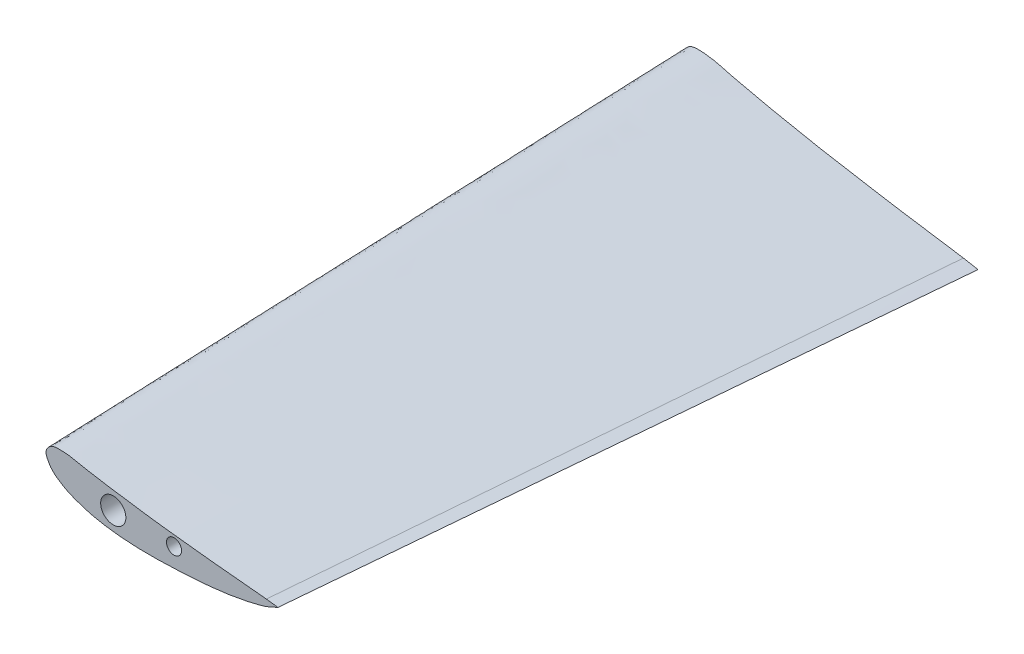
ISO-10303-21;
HEADER;
FILE_DESCRIPTION(('STEP AP214'),'2;1');
FILE_NAME('part.step','',(''),(''),'','','');
FILE_SCHEMA(('AUTOMOTIVE_DESIGN { 1 0 10303 214 1 1 1 1 }'));
ENDSEC;
DATA;
#1=APPLICATION_CONTEXT('core data for automotive mechanical design processes');
#2=APPLICATION_PROTOCOL_DEFINITION('international standard','automotive_design',2000,#1);
#3=PRODUCT_CONTEXT('',#1,'mechanical');
#4=PRODUCT('Part','Part','',(#3));
#5=PRODUCT_RELATED_PRODUCT_CATEGORY('part','',(#4));
#6=PRODUCT_DEFINITION_FORMATION('','',#4);
#7=PRODUCT_DEFINITION_CONTEXT('part definition',#1,'design');
#8=PRODUCT_DEFINITION('design','',#6,#7);
#9=PRODUCT_DEFINITION_SHAPE('','',#8);
#10=(LENGTH_UNIT() NAMED_UNIT(*) SI_UNIT(.MILLI.,.METRE.));
#11=(NAMED_UNIT(*) PLANE_ANGLE_UNIT() SI_UNIT($,.RADIAN.));
#12=(NAMED_UNIT(*) SI_UNIT($,.STERADIAN.) SOLID_ANGLE_UNIT());
#13=UNCERTAINTY_MEASURE_WITH_UNIT(LENGTH_MEASURE(1.E-05),#10,'distance_accuracy_value','');
#14=(GEOMETRIC_REPRESENTATION_CONTEXT(3) GLOBAL_UNCERTAINTY_ASSIGNED_CONTEXT((#13)) GLOBAL_UNIT_ASSIGNED_CONTEXT((#10,
#11,#12)) REPRESENTATION_CONTEXT('',''));
#15=CARTESIAN_POINT('',(0.,0.,0.));
#16=DIRECTION('',(0.,0.,1.));
#17=DIRECTION('',(1.,0.,0.));
#18=AXIS2_PLACEMENT_3D('',#15,#16,#17);
#19=CARTESIAN_POINT('',(-15.9573386578838,2.72947172335381,-130.));
#20=DIRECTION('',(0.,0.,1.));
#21=DIRECTION('',(1.,0.,0.));
#22=AXIS2_PLACEMENT_3D('',#19,#20,#21);
#23=PLANE('',#22);
#24=CARTESIAN_POINT('',(12.063322186895,-0.172116284613179,-130.));
#25=DIRECTION('',(0.,0.,1.));
#26=DIRECTION('',(1.,0.,0.));
#27=AXIS2_PLACEMENT_3D('',#24,#25,#26);
#28=CIRCLE('',#27,1.5);
#29=CARTESIAN_POINT('',(13.563322186895,-0.172116284613179,-130.));
#30=VERTEX_POINT('',#29);
#31=EDGE_CURVE('E87',#30,#30,#28,.T.);
#32=ORIENTED_EDGE('',*,*,#31,.T.);
#33=EDGE_LOOP('',(#32));
#34=FACE_BOUND('',#33,.T.);
#35=CARTESIAN_POINT('',(0.,0.,-130.));
#36=DIRECTION('',(0.,0.,1.));
#37=DIRECTION('',(1.,0.,0.));
#38=AXIS2_PLACEMENT_3D('',#35,#36,#37);
#39=CIRCLE('',#38,2.5);
#40=CARTESIAN_POINT('',(2.5,0.,-130.));
#41=VERTEX_POINT('',#40);
#42=EDGE_CURVE('E68',#41,#41,#39,.T.);
#43=ORIENTED_EDGE('',*,*,#42,.T.);
#44=EDGE_LOOP('',(#43));
#45=FACE_BOUND('',#44,.T.);
#46=CARTESIAN_POINT('',(38.8120781774416,-2.20153056453192,-130.));
#47=CARTESIAN_POINT('',(37.8397868419316,-2.05195685649604,-130.));
#48=CARTESIAN_POINT('',(34.9229128354023,-1.60323573238921,-130.));
#49=CARTESIAN_POINT('',(30.062980923386,-0.846025072664264,-130.));
#50=CARTESIAN_POINT('',(24.2243965531818,0.0176889752878256,-130.));
#51=CARTESIAN_POINT('',(18.4132903557065,1.04566342823261,-130.));
#52=CARTESIAN_POINT('',(12.5873231478176,1.98257894073304,-130.));
#53=CARTESIAN_POINT('',(6.79722177850616,3.11883992926039,-130.));
#54=CARTESIAN_POINT('',(1.00440763839932,4.24699575258884,-130.));
#55=CARTESIAN_POINT('',(-3.79170799952262,5.33941839040036,-130.));
#56=CARTESIAN_POINT('',(-7.63590457845037,6.19843141355677,-130.));
#57=CARTESIAN_POINT('',(-9.99480768621524,6.91459953998816,-130.));
#58=CARTESIAN_POINT('',(-11.9472230297003,7.23200790023331,-130.));
#59=CARTESIAN_POINT('',(-13.4277399267656,7.35528494884751,-130.));
#60=CARTESIAN_POINT('',(-14.768994504793,7.36382199207013,-130.));
#61=CARTESIAN_POINT('',(-16.0847204559753,6.74822291699015,-130.));
#62=CARTESIAN_POINT('',(-17.1492251932457,5.30606659514906,-130.));
#63=CARTESIAN_POINT('',(-16.4517203902266,3.68648758126931,-130.));
#64=CARTESIAN_POINT('',(-15.7478921773808,2.26296929841352,-130.));
#65=CARTESIAN_POINT('',(-14.6557396375938,1.10186245155615,-130.));
#66=CARTESIAN_POINT('',(-13.2899093160326,0.0781647088307033,-130.));
#67=CARTESIAN_POINT('',(-11.5384922386438,-1.10058705011428,-130.));
#68=CARTESIAN_POINT('',(-9.19576672428071,-2.13584430490646,-130.));
#69=CARTESIAN_POINT('',(-5.47589025803957,-3.5743655347333,-130.));
#70=CARTESIAN_POINT('',(-0.643108893754979,-4.68760771879476,-130.));
#71=CARTESIAN_POINT('',(5.22471927578042,-5.49019662314985,-130.));
#72=CARTESIAN_POINT('',(11.1624164545053,-5.82550900839239,-130.));
#73=CARTESIAN_POINT('',(17.1412966125503,-5.93304648920771,-130.));
#74=CARTESIAN_POINT('',(23.1670560499333,-5.85696775159353,-130.));
#75=CARTESIAN_POINT('',(29.2675115694788,-5.51749328815515,-130.));
#76=CARTESIAN_POINT('',(34.3818603874594,-4.80270030943601,-130.));
#77=CARTESIAN_POINT('',(38.5985870919679,-3.99453880924095,-130.));
#78=CARTESIAN_POINT('',(40.6515069729154,-3.16590061016798,-130.));
#79=CARTESIAN_POINT('',(41.71283654,-2.73750677500001,-130.));
#80=B_SPLINE_CURVE_WITH_KNOTS('',3,(#46,#47,#48,#49,#50,#51,#52,#53,#54,#55,#56,#57,#58,#59,#60,
#61,#62,#63,#64,#65,#66,#67,#68,#69,#70,#71,#72,#73,#74,#75,#76,#77,#78,#79),.UNSPECIFIED.,.F.,
.F.,(4,1,1,1,1,1,1,1,1,1,1,1,1,1,1,1,1,1,1,1,1,1,1,1,1,1,1,1,1,1,1,4),(0.,0.024539223239315,
0.0736176697179449,0.122696116196575,0.171758102468826,0.220820088741077,0.269879113320182,
0.318936693489756,0.368025361597795,0.392583028094628,0.417173001250673,0.429440472758663,
0.441764658743505,0.454461371263475,0.461994015532278,0.477712656864197,0.492780517083889,
0.502278122505289,0.517831839222446,0.531656069899839,0.544957030128068,0.57036121074101,
0.595284183630096,0.644429948946362,0.693535769444944,0.742943262592495,0.792666042354747,
0.842690657547491,0.893260265870848,0.94491578158227,0.971522264346957,1.),.UNSPECIFIED.);
#81=CARTESIAN_POINT('',(38.8120781774416,-2.20153056453192,-130.));
#82=VERTEX_POINT('',#81);
#83=CARTESIAN_POINT('',(41.71283654,-2.73750677500001,-130.));
#84=VERTEX_POINT('',#83);
#85=EDGE_CURVE('E63',#82,#84,#80,.T.);
#86=ORIENTED_EDGE('',*,*,#85,.F.);
#87=DIRECTION('',(-0.983354838258924,0.18169552023307,0.));
#88=VECTOR('',#87,1.);
#89=CARTESIAN_POINT('',(38.8120781774416,-2.20153056453192,-130.));
#90=LINE('',#89,#88);
#91=EDGE_CURVE('E37',#84,#82,#90,.T.);
#92=ORIENTED_EDGE('',*,*,#91,.F.);
#93=EDGE_LOOP('',(#86,#92));
#94=FACE_BOUND('',#93,.T.);
#95=ADVANCED_FACE('F34',(#34,#45,#94),#23,.F.);
#96=CARTESIAN_POINT('',(-12.5819997362755,1.44490278911865,0.));
#97=DIRECTION('',(0.,0.,1.));
#98=DIRECTION('',(1.,0.,0.));
#99=AXIS2_PLACEMENT_3D('',#96,#97,#98);
#100=PLANE('',#99);
#101=CARTESIAN_POINT('',(12.063322186895,-0.172116284613179,0.));
#102=DIRECTION('',(0.,0.,1.));
#103=DIRECTION('',(1.,0.,0.));
#104=AXIS2_PLACEMENT_3D('',#101,#102,#103);
#105=CIRCLE('',#104,1.5);
#106=CARTESIAN_POINT('',(13.563322186895,-0.172116284613179,0.));
#107=VERTEX_POINT('',#106);
#108=EDGE_CURVE('E90',#107,#107,#105,.T.);
#109=ORIENTED_EDGE('',*,*,#108,.F.);
#110=EDGE_LOOP('',(#109));
#111=FACE_BOUND('',#110,.T.);
#112=CARTESIAN_POINT('',(0.,0.,0.));
#113=DIRECTION('',(0.,0.,1.));
#114=DIRECTION('',(1.,0.,0.));
#115=AXIS2_PLACEMENT_3D('',#112,#113,#114);
#116=CIRCLE('',#115,2.5);
#117=CARTESIAN_POINT('',(2.5,0.,0.));
#118=VERTEX_POINT('',#117);
#119=EDGE_CURVE('E84',#118,#118,#116,.T.);
#120=ORIENTED_EDGE('',*,*,#119,.F.);
#121=EDGE_LOOP('',(#120));
#122=FACE_BOUND('',#121,.T.);
#123=CARTESIAN_POINT('',(30.4113785621477,-0.0484002442627476,0.));
#124=CARTESIAN_POINT('',(29.6454694877873,0.026566871565662,0.));
#125=CARTESIAN_POINT('',(27.3477422647068,0.251468219050302,0.));
#126=CARTESIAN_POINT('',(23.5189856354564,0.633666696272388,0.));
#127=CARTESIAN_POINT('',(18.9212057833677,1.05691563565401,0.));
#128=CARTESIAN_POINT('',(14.3378164362077,1.60965355839776,0.));
#129=CARTESIAN_POINT('',(9.74673995821571,2.09062433500616,0.));
#130=CARTESIAN_POINT('',(5.17509493438157,2.72885063741591,0.));
#131=CARTESIAN_POINT('',(0.60167993974661,3.36062908634859,0.));
#132=CARTESIAN_POINT('',(-3.19166320344617,4.00741358924806,0.));
#133=CARTESIAN_POINT('',(-6.23140034199928,4.5128685145492,0.));
#134=CARTESIAN_POINT('',(-8.10480601021255,4.97070206772562,0.));
#135=CARTESIAN_POINT('',(-9.6435286668681,5.134562868883,0.));
#136=CARTESIAN_POINT('',(-10.8052865093902,5.16710523802775,0.));
#137=CARTESIAN_POINT('',(-11.8533241938368,5.1160194218416,0.));
#138=CARTESIAN_POINT('',(-12.8545459614183,4.57851263632639,0.));
#139=CARTESIAN_POINT('',(-13.6239443974408,3.4061895897156,0.));
#140=CARTESIAN_POINT('',(-13.0093761995299,2.17115138802204,0.));
#141=CARTESIAN_POINT('',(-12.3983110532503,1.08953086614345,0.));
#142=CARTESIAN_POINT('',(-11.4952204988513,0.229604254835794,0.));
#143=CARTESIAN_POINT('',(-10.3842737514795,-0.511205932124786,0.));
#144=CARTESIAN_POINT('',(-8.96546395144117,-1.35652737302625,0.));
#145=CARTESIAN_POINT('',(-7.09095487017499,-2.06430188624797,0.));
#146=CARTESIAN_POINT('',(-4.12337213787246,-3.02777084468667,0.));
#147=CARTESIAN_POINT('',(-0.300492468612642,-3.68923892534138,0.));
#148=CARTESIAN_POINT('',(4.31749802810697,-4.06348304674317,0.));
#149=CARTESIAN_POINT('',(8.96994319746569,-4.06972331148482,0.));
#150=CARTESIAN_POINT('',(13.6447489370111,-3.89627252679786,0.));
#151=CARTESIAN_POINT('',(18.3482661610054,-3.5773782916158,0.));
#152=CARTESIAN_POINT('',(23.0987876160855,-3.04952608629674,0.));
#153=CARTESIAN_POINT('',(27.0628881136656,-2.27096966882288,0.));
#154=CARTESIAN_POINT('',(30.3218247503512,-1.45813343814418,0.));
#155=CARTESIAN_POINT('',(31.8897041320066,-0.722475780532528,0.));
#156=CARTESIAN_POINT('',(32.7002748517004,-0.34215152602974,0.));
#157=B_SPLINE_CURVE_WITH_KNOTS('',3,(#123,#124,#125,#126,#127,#128,#129,#130,#131,#132,#133,
#134,#135,#136,#137,#138,#139,#140,#141,#142,#143,#144,#145,#146,#147,#148,#149,#150,#151,#152,
#153,#154,#155,#156),.UNSPECIFIED.,.F.,.F.,(4,1,1,1,1,1,1,1,1,1,1,1,1,1,1,1,1,1,1,1,1,1,1,1,1,1,
1,1,1,1,1,4),(0.,0.024539223239315,0.0736176697179449,0.122696116196575,0.171758102468826,
0.220820088741077,0.269879113320182,0.318936693489756,0.368025361597795,0.392583028094628,
0.417173001250673,0.429440472758663,0.441764658743505,0.454461371263475,0.461994015532278,
0.477712656864197,0.492780517083889,0.502278122505289,0.517831839222446,0.531656069899839,
0.544957030128068,0.57036121074101,0.595284183630096,0.644429948946362,0.693535769444944,
0.742943262592495,0.792666042354747,0.842690657547491,0.893260265870848,0.94491578158227,
0.971522264346957,1.),.UNSPECIFIED.);
#158=CARTESIAN_POINT('',(30.4113785621477,-0.0484002442627476,0.));
#159=VERTEX_POINT('',#158);
#160=CARTESIAN_POINT('',(32.7002748517004,-0.34215152602974,0.));
#161=VERTEX_POINT('',#160);
#162=EDGE_CURVE('E43',#159,#161,#157,.T.);
#163=ORIENTED_EDGE('',*,*,#162,.T.);
#164=DIRECTION('',(-0.991865092818963,0.127293509839388,0.));
#165=VECTOR('',#164,1.);
#166=CARTESIAN_POINT('',(32.7002748517004,-0.34215152602974,0.));
#167=LINE('',#166,#165);
#168=EDGE_CURVE('E11',#161,#159,#167,.T.);
#169=ORIENTED_EDGE('',*,*,#168,.T.);
#170=EDGE_LOOP('',(#163,#169));
#171=FACE_BOUND('',#170,.T.);
#172=ADVANCED_FACE('F105',(#111,#122,#171),#100,.T.);
#173=CARTESIAN_POINT('',(32.7002748517004,-0.34215152602974,0.));
#174=CARTESIAN_POINT('',(41.71283654,-2.73750677500001,-130.));
#175=CARTESIAN_POINT('',(31.8897041320066,-0.722475780532528,0.));
#176=CARTESIAN_POINT('',(40.6515069729154,-3.16590061016798,-130.));
#177=CARTESIAN_POINT('',(30.3218247503512,-1.45813343814418,0.));
#178=CARTESIAN_POINT('',(38.5985870919679,-3.99453880924095,-130.));
#179=CARTESIAN_POINT('',(27.0628881136656,-2.27096966882288,0.));
#180=CARTESIAN_POINT('',(34.3818603874594,-4.80270030943601,-130.));
#181=CARTESIAN_POINT('',(23.0987876160855,-3.04952608629674,0.));
#182=CARTESIAN_POINT('',(29.2675115694788,-5.51749328815515,-130.));
#183=CARTESIAN_POINT('',(18.3482661610054,-3.5773782916158,0.));
#184=CARTESIAN_POINT('',(23.1670560499333,-5.85696775159353,-130.));
#185=CARTESIAN_POINT('',(13.6447489370111,-3.89627252679786,0.));
#186=CARTESIAN_POINT('',(17.1412966125503,-5.93304648920771,-130.));
#187=CARTESIAN_POINT('',(8.96994319746569,-4.06972331148482,0.));
#188=CARTESIAN_POINT('',(11.1624164545053,-5.82550900839239,-130.));
#189=CARTESIAN_POINT('',(4.31749802810697,-4.06348304674317,0.));
#190=CARTESIAN_POINT('',(5.22471927578042,-5.49019662314985,-130.));
#191=CARTESIAN_POINT('',(-0.300492468612642,-3.68923892534138,0.));
#192=CARTESIAN_POINT('',(-0.643108893754979,-4.68760771879476,-130.));
#193=CARTESIAN_POINT('',(-4.12337213787246,-3.02777084468667,0.));
#194=CARTESIAN_POINT('',(-5.47589025803957,-3.5743655347333,-130.));
#195=CARTESIAN_POINT('',(-7.09095487017499,-2.06430188624797,0.));
#196=CARTESIAN_POINT('',(-9.19576672428071,-2.13584430490646,-130.));
#197=CARTESIAN_POINT('',(-8.96546395144117,-1.35652737302625,0.));
#198=CARTESIAN_POINT('',(-11.5384922386438,-1.10058705011428,-130.));
#199=CARTESIAN_POINT('',(-10.3842737514795,-0.511205932124786,0.));
#200=CARTESIAN_POINT('',(-13.2899093160326,0.0781647088307033,-130.));
#201=CARTESIAN_POINT('',(-11.4952204988513,0.229604254835794,0.));
#202=CARTESIAN_POINT('',(-14.6557396375938,1.10186245155615,-130.));
#203=CARTESIAN_POINT('',(-12.3983110532503,1.08953086614345,0.));
#204=CARTESIAN_POINT('',(-15.7478921773808,2.26296929841352,-130.));
#205=CARTESIAN_POINT('',(-13.0093761995299,2.17115138802204,0.));
#206=CARTESIAN_POINT('',(-16.4517203902266,3.68648758126931,-130.));
#207=CARTESIAN_POINT('',(-13.6239443974408,3.4061895897156,0.));
#208=CARTESIAN_POINT('',(-17.1492251932457,5.30606659514906,-130.));
#209=CARTESIAN_POINT('',(-12.8545459614183,4.57851263632639,0.));
#210=CARTESIAN_POINT('',(-16.0847204559753,6.74822291699015,-130.));
#211=CARTESIAN_POINT('',(-11.8533241938368,5.1160194218416,0.));
#212=CARTESIAN_POINT('',(-14.768994504793,7.36382199207013,-130.));
#213=CARTESIAN_POINT('',(-10.8052865093902,5.16710523802775,0.));
#214=CARTESIAN_POINT('',(-13.4277399267656,7.35528494884751,-130.));
#215=CARTESIAN_POINT('',(-9.6435286668681,5.134562868883,0.));
#216=CARTESIAN_POINT('',(-11.9472230297003,7.23200790023331,-130.));
#217=CARTESIAN_POINT('',(-8.10480601021255,4.97070206772562,0.));
#218=CARTESIAN_POINT('',(-9.99480768621524,6.91459953998816,-130.));
#219=CARTESIAN_POINT('',(-6.23140034199928,4.5128685145492,0.));
#220=CARTESIAN_POINT('',(-7.63590457845037,6.19843141355677,-130.));
#221=CARTESIAN_POINT('',(-3.19166320344617,4.00741358924806,0.));
#222=CARTESIAN_POINT('',(-3.79170799952262,5.33941839040036,-130.));
#223=CARTESIAN_POINT('',(0.60167993974661,3.36062908634859,0.));
#224=CARTESIAN_POINT('',(1.00440763839932,4.24699575258884,-130.));
#225=CARTESIAN_POINT('',(5.17509493438157,2.72885063741591,0.));
#226=CARTESIAN_POINT('',(6.79722177850616,3.11883992926039,-130.));
#227=CARTESIAN_POINT('',(9.74673995821571,2.09062433500616,0.));
#228=CARTESIAN_POINT('',(12.5873231478176,1.98257894073304,-130.));
#229=CARTESIAN_POINT('',(14.3378164362077,1.60965355839776,0.));
#230=CARTESIAN_POINT('',(18.4132903557065,1.04566342823261,-130.));
#231=CARTESIAN_POINT('',(18.9212057833677,1.05691563565401,0.));
#232=CARTESIAN_POINT('',(24.2243965531818,0.0176889752878256,-130.));
#233=CARTESIAN_POINT('',(23.5189856354564,0.633666696272388,0.));
#234=CARTESIAN_POINT('',(30.062980923386,-0.846025072664264,-130.));
#235=CARTESIAN_POINT('',(27.3477422647068,0.251468219050302,0.));
#236=CARTESIAN_POINT('',(34.9229128354023,-1.60323573238921,-130.));
#237=CARTESIAN_POINT('',(29.6454694877873,0.026566871565662,0.));
#238=CARTESIAN_POINT('',(37.8397868419316,-2.05195685649604,-130.));
#239=CARTESIAN_POINT('',(30.4113785621477,-0.0484002442627476,0.));
#240=CARTESIAN_POINT('',(38.8120781774416,-2.20153056453192,-130.));
#241=B_SPLINE_SURFACE_WITH_KNOTS('',3,1,((#173,#174),(#175,#176),(#177,#178),(#179,#180),(#181,
#182),(#183,#184),(#185,#186),(#187,#188),(#189,#190),(#191,#192),(#193,#194),(#195,#196),(#197,
#198),(#199,#200),(#201,#202),(#203,#204),(#205,#206),(#207,#208),(#209,#210),(#211,#212),(#213,
#214),(#215,#216),(#217,#218),(#219,#220),(#221,#222),(#223,#224),(#225,#226),(#227,#228),(#229,
#230),(#231,#232),(#233,#234),(#235,#236),(#237,#238),(#239,#240)),.UNSPECIFIED.,.F.,.F.,.F.,(4,
1,1,1,1,1,1,1,1,1,1,1,1,1,1,1,1,1,1,1,1,1,1,1,1,1,1,1,1,1,1,4),(2,2),(0.,0.0284777356530428,
0.05508421841773,0.106739734129152,0.157309342452509,0.207333957645253,0.257056737407505,
0.306464230555056,0.355570051053638,0.404715816369904,0.42963878925899,0.455042969871932,
0.468343930100161,0.482168160777554,0.497721877494711,0.507219482916111,0.522287343135803,
0.538005984467722,0.545538628736525,0.558235341256495,0.570559527241337,0.582826998749327,
0.607416971905372,0.631974638402205,0.681063306510244,0.730120886679818,0.779179911258923,
0.828241897531174,0.877303883803425,0.926382330282055,0.975460776760685,1.),(0.,1.),.UNSPECIFIED.);
#242=DIRECTION('',(0.0644774579899811,-0.0165258104836133,-0.997782318443762));
#243=VECTOR('',#242,1.);
#244=CARTESIAN_POINT('',(34.6117283697947,-1.12496540439733,-65.));
#245=LINE('',#244,#243);
#246=EDGE_CURVE('E58',#159,#82,#245,.T.);
#247=DIRECTION('',(-0.0691497106549988,0.0183785840375731,0.997436988067469));
#248=VECTOR('',#247,1.);
#249=CARTESIAN_POINT('',(37.2065556958502,-1.53982915051487,-65.));
#250=LINE('',#249,#248);
#251=EDGE_CURVE('E66',#84,#161,#250,.T.);
#252=ORIENTED_EDGE('',*,*,#162,.F.);
#253=ORIENTED_EDGE('',*,*,#246,.T.);
#254=ORIENTED_EDGE('',*,*,#85,.T.);
#255=ORIENTED_EDGE('',*,*,#251,.T.);
#256=EDGE_LOOP('',(#252,#253,#254,#255));
#257=FACE_BOUND('',#256,.T.);
#258=ADVANCED_FACE('F67',(#257),#241,.T.);
#259=CARTESIAN_POINT('',(30.4113785621477,-0.0484002442627475,0.));
#260=CARTESIAN_POINT('',(38.8120781774416,-2.20153056453192,-130.));
#261=CARTESIAN_POINT('',(30.7928612770732,-0.0973587912239136,0.));
#262=CARTESIAN_POINT('',(39.2955379045347,-2.29085993294327,-130.));
#263=CARTESIAN_POINT('',(31.1743439919986,-0.146317338185079,0.));
#264=CARTESIAN_POINT('',(39.7789976316277,-2.38018930135461,-130.));
#265=CARTESIAN_POINT('',(31.9373094218495,-0.24423443210741,0.));
#266=CARTESIAN_POINT('',(40.7459170858139,-2.55884803817731,-130.));
#267=CARTESIAN_POINT('',(32.3187921367749,-0.293192979068575,0.));
#268=CARTESIAN_POINT('',(41.2293768129069,-2.64817740658866,-130.));
#269=CARTESIAN_POINT('',(32.7002748517004,-0.34215152602974,0.));
#270=CARTESIAN_POINT('',(41.71283654,-2.73750677500001,-130.));
#271=B_SPLINE_SURFACE_WITH_KNOTS('',3,1,((#259,#260),(#261,#262),(#263,#264),(#265,#266),(#267,
#268),(#269,#270)),.UNSPECIFIED.,.F.,.F.,.F.,(4,2,4),(2,2),(0.,0.5,1.),(0.,1.),.UNSPECIFIED.);
#272=ORIENTED_EDGE('',*,*,#168,.F.);
#273=ORIENTED_EDGE('',*,*,#251,.F.);
#274=ORIENTED_EDGE('',*,*,#91,.T.);
#275=ORIENTED_EDGE('',*,*,#246,.F.);
#276=EDGE_LOOP('',(#272,#273,#274,#275));
#277=FACE_BOUND('',#276,.T.);
#278=ADVANCED_FACE('F69',(#277),#271,.T.);
#279=CARTESIAN_POINT('',(0.,0.,-130.));
#280=DIRECTION('',(0.,0.,1.));
#281=DIRECTION('',(1.,0.,0.));
#282=AXIS2_PLACEMENT_3D('',#279,#280,#281);
#283=CYLINDRICAL_SURFACE('',#282,2.5);
#284=ORIENTED_EDGE('',*,*,#42,.F.);
#285=EDGE_LOOP('',(#284));
#286=FACE_BOUND('',#285,.T.);
#287=ORIENTED_EDGE('',*,*,#119,.T.);
#288=EDGE_LOOP('',(#287));
#289=FACE_BOUND('',#288,.T.);
#290=ADVANCED_FACE('F101',(#286,#289),#283,.F.);
#291=CARTESIAN_POINT('',(12.063322186895,-0.172116284613179,-130.));
#292=DIRECTION('',(0.,0.,1.));
#293=DIRECTION('',(1.,0.,0.));
#294=AXIS2_PLACEMENT_3D('',#291,#292,#293);
#295=CYLINDRICAL_SURFACE('',#294,1.5);
#296=ORIENTED_EDGE('',*,*,#31,.F.);
#297=EDGE_LOOP('',(#296));
#298=FACE_BOUND('',#297,.T.);
#299=ORIENTED_EDGE('',*,*,#108,.T.);
#300=EDGE_LOOP('',(#299));
#301=FACE_BOUND('',#300,.T.);
#302=ADVANCED_FACE('F98',(#298,#301),#295,.F.);
#303=CLOSED_SHELL('',(#95,#172,#258,#278,#290,#302));
#304=MANIFOLD_SOLID_BREP('B2',#303);
#305=ADVANCED_BREP_SHAPE_REPRESENTATION('',(#18,#304),#14);
#306=SHAPE_DEFINITION_REPRESENTATION(#9,#305);
ENDSEC;
END-ISO-10303-21;
